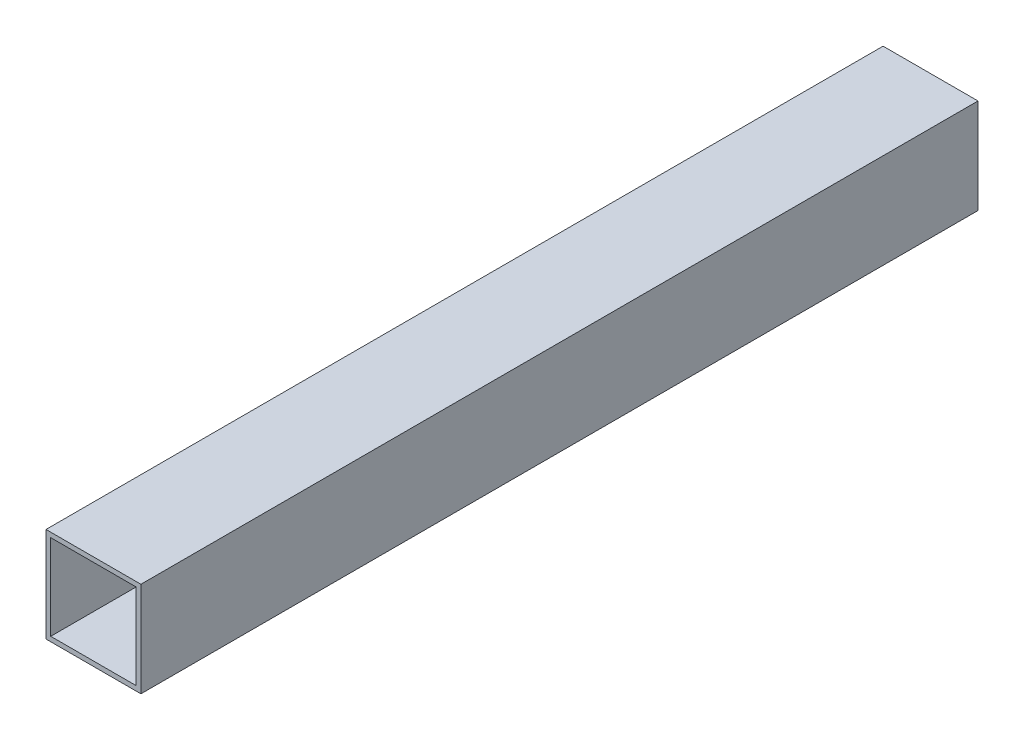
ISO-10303-21;
HEADER;
FILE_DESCRIPTION(('STEP AP214'),'2;1');
FILE_NAME('part.step','',(''),(''),'','','');
FILE_SCHEMA(('AUTOMOTIVE_DESIGN { 1 0 10303 214 1 1 1 1 }'));
ENDSEC;
DATA;
#1=APPLICATION_CONTEXT('core data for automotive mechanical design processes');
#2=APPLICATION_PROTOCOL_DEFINITION('international standard','automotive_design',2000,#1);
#3=PRODUCT_CONTEXT('',#1,'mechanical');
#4=PRODUCT('Part','Part','',(#3));
#5=PRODUCT_RELATED_PRODUCT_CATEGORY('part','',(#4));
#6=PRODUCT_DEFINITION_FORMATION('','',#4);
#7=PRODUCT_DEFINITION_CONTEXT('part definition',#1,'design');
#8=PRODUCT_DEFINITION('design','',#6,#7);
#9=PRODUCT_DEFINITION_SHAPE('','',#8);
#10=(LENGTH_UNIT() NAMED_UNIT(*) SI_UNIT(.MILLI.,.METRE.));
#11=(NAMED_UNIT(*) PLANE_ANGLE_UNIT() SI_UNIT($,.RADIAN.));
#12=(NAMED_UNIT(*) SI_UNIT($,.STERADIAN.) SOLID_ANGLE_UNIT());
#13=UNCERTAINTY_MEASURE_WITH_UNIT(LENGTH_MEASURE(1.E-05),#10,'distance_accuracy_value','');
#14=(GEOMETRIC_REPRESENTATION_CONTEXT(3) GLOBAL_UNCERTAINTY_ASSIGNED_CONTEXT((#13)) GLOBAL_UNIT_ASSIGNED_CONTEXT((#10,
#11,#12)) REPRESENTATION_CONTEXT('',''));
#15=CARTESIAN_POINT('',(0.,0.,0.));
#16=DIRECTION('',(0.,0.,1.));
#17=DIRECTION('',(1.,0.,0.));
#18=AXIS2_PLACEMENT_3D('',#15,#16,#17);
#19=CARTESIAN_POINT('',(0.,0.,280.));
#20=DIRECTION('',(0.,0.,1.));
#21=DIRECTION('',(1.,0.,0.));
#22=AXIS2_PLACEMENT_3D('',#19,#20,#21);
#23=PLANE('',#22);
#24=DIRECTION('',(0.,1.,0.));
#25=VECTOR('',#24,1.);
#26=CARTESIAN_POINT('',(15.875,15.875,280.));
#27=LINE('',#26,#25);
#28=CARTESIAN_POINT('',(15.875,-15.875,280.));
#29=VERTEX_POINT('',#28);
#30=CARTESIAN_POINT('',(15.875,15.875,280.));
#31=VERTEX_POINT('',#30);
#32=EDGE_CURVE('E134',#29,#31,#27,.T.);
#33=ORIENTED_EDGE('',*,*,#32,.T.);
#34=DIRECTION('',(-1.,0.,0.));
#35=VECTOR('',#34,1.);
#36=CARTESIAN_POINT('',(-15.875,15.875,280.));
#37=LINE('',#36,#35);
#38=CARTESIAN_POINT('',(-15.875,15.875,280.));
#39=VERTEX_POINT('',#38);
#40=EDGE_CURVE('E137',#31,#39,#37,.T.);
#41=ORIENTED_EDGE('',*,*,#40,.T.);
#42=DIRECTION('',(0.,-1.,0.));
#43=VECTOR('',#42,1.);
#44=CARTESIAN_POINT('',(-15.875,15.875,280.));
#45=LINE('',#44,#43);
#46=CARTESIAN_POINT('',(-15.875,-15.875,280.));
#47=VERTEX_POINT('',#46);
#48=EDGE_CURVE('E140',#39,#47,#45,.T.);
#49=ORIENTED_EDGE('',*,*,#48,.T.);
#50=DIRECTION('',(1.,0.,0.));
#51=VECTOR('',#50,1.);
#52=CARTESIAN_POINT('',(-15.875,-15.875,280.));
#53=LINE('',#52,#51);
#54=EDGE_CURVE('E142',#47,#29,#53,.T.);
#55=ORIENTED_EDGE('',*,*,#54,.T.);
#56=EDGE_LOOP('',(#33,#41,#49,#55));
#57=FACE_BOUND('',#56,.T.);
#58=DIRECTION('',(-1.,0.,0.));
#59=VECTOR('',#58,1.);
#60=CARTESIAN_POINT('',(-14.2875,14.2875,280.));
#61=LINE('',#60,#59);
#62=CARTESIAN_POINT('',(14.2875,14.2875,280.));
#63=VERTEX_POINT('',#62);
#64=CARTESIAN_POINT('',(-14.2875,14.2875,280.));
#65=VERTEX_POINT('',#64);
#66=EDGE_CURVE('E106',#63,#65,#61,.T.);
#67=ORIENTED_EDGE('',*,*,#66,.F.);
#68=DIRECTION('',(0.,1.,0.));
#69=VECTOR('',#68,1.);
#70=CARTESIAN_POINT('',(14.2875,14.2875,280.));
#71=LINE('',#70,#69);
#72=CARTESIAN_POINT('',(14.2875,-14.2875,280.));
#73=VERTEX_POINT('',#72);
#74=EDGE_CURVE('E98',#73,#63,#71,.T.);
#75=ORIENTED_EDGE('',*,*,#74,.F.);
#76=DIRECTION('',(1.,0.,0.));
#77=VECTOR('',#76,1.);
#78=CARTESIAN_POINT('',(-14.2875,-14.2875,280.));
#79=LINE('',#78,#77);
#80=CARTESIAN_POINT('',(-14.2875,-14.2875,280.));
#81=VERTEX_POINT('',#80);
#82=EDGE_CURVE('E120',#81,#73,#79,.T.);
#83=ORIENTED_EDGE('',*,*,#82,.F.);
#84=DIRECTION('',(0.,-1.,0.));
#85=VECTOR('',#84,1.);
#86=CARTESIAN_POINT('',(-14.2875,14.2875,280.));
#87=LINE('',#86,#85);
#88=EDGE_CURVE('E118',#65,#81,#87,.T.);
#89=ORIENTED_EDGE('',*,*,#88,.F.);
#90=EDGE_LOOP('',(#67,#75,#83,#89));
#91=FACE_BOUND('',#90,.T.);
#92=ADVANCED_FACE('F33',(#57,#91),#23,.T.);
#93=CARTESIAN_POINT('',(0.,0.,0.));
#94=DIRECTION('',(0.,0.,1.));
#95=DIRECTION('',(1.,0.,0.));
#96=AXIS2_PLACEMENT_3D('',#93,#94,#95);
#97=PLANE('',#96);
#98=DIRECTION('',(0.,1.,0.));
#99=VECTOR('',#98,1.);
#100=CARTESIAN_POINT('',(15.875,15.875,0.));
#101=LINE('',#100,#99);
#102=CARTESIAN_POINT('',(15.875,-15.875,0.));
#103=VERTEX_POINT('',#102);
#104=CARTESIAN_POINT('',(15.875,15.875,0.));
#105=VERTEX_POINT('',#104);
#106=EDGE_CURVE('E114',#103,#105,#101,.T.);
#107=ORIENTED_EDGE('',*,*,#106,.F.);
#108=DIRECTION('',(1.,0.,0.));
#109=VECTOR('',#108,1.);
#110=CARTESIAN_POINT('',(-15.875,-15.875,0.));
#111=LINE('',#110,#109);
#112=CARTESIAN_POINT('',(-15.875,-15.875,0.));
#113=VERTEX_POINT('',#112);
#114=EDGE_CURVE('E138',#113,#103,#111,.T.);
#115=ORIENTED_EDGE('',*,*,#114,.F.);
#116=DIRECTION('',(0.,-1.,0.));
#117=VECTOR('',#116,1.);
#118=CARTESIAN_POINT('',(-15.875,15.875,0.));
#119=LINE('',#118,#117);
#120=CARTESIAN_POINT('',(-15.875,15.875,0.));
#121=VERTEX_POINT('',#120);
#122=EDGE_CURVE('E149',#121,#113,#119,.T.);
#123=ORIENTED_EDGE('',*,*,#122,.F.);
#124=DIRECTION('',(-1.,0.,0.));
#125=VECTOR('',#124,1.);
#126=CARTESIAN_POINT('',(-15.875,15.875,0.));
#127=LINE('',#126,#125);
#128=EDGE_CURVE('E147',#105,#121,#127,.T.);
#129=ORIENTED_EDGE('',*,*,#128,.F.);
#130=EDGE_LOOP('',(#107,#115,#123,#129));
#131=FACE_BOUND('',#130,.T.);
#132=DIRECTION('',(0.,1.,0.));
#133=VECTOR('',#132,1.);
#134=CARTESIAN_POINT('',(14.2875,14.2875,0.));
#135=LINE('',#134,#133);
#136=CARTESIAN_POINT('',(14.2875,-14.2875,0.));
#137=VERTEX_POINT('',#136);
#138=CARTESIAN_POINT('',(14.2875,14.2875,0.));
#139=VERTEX_POINT('',#138);
#140=EDGE_CURVE('E56',#137,#139,#135,.T.);
#141=ORIENTED_EDGE('',*,*,#140,.T.);
#142=DIRECTION('',(-1.,0.,0.));
#143=VECTOR('',#142,1.);
#144=CARTESIAN_POINT('',(-14.2875,14.2875,0.));
#145=LINE('',#144,#143);
#146=CARTESIAN_POINT('',(-14.2875,14.2875,0.));
#147=VERTEX_POINT('',#146);
#148=EDGE_CURVE('E113',#139,#147,#145,.T.);
#149=ORIENTED_EDGE('',*,*,#148,.T.);
#150=DIRECTION('',(0.,-1.,0.));
#151=VECTOR('',#150,1.);
#152=CARTESIAN_POINT('',(-14.2875,14.2875,0.));
#153=LINE('',#152,#151);
#154=CARTESIAN_POINT('',(-14.2875,-14.2875,0.));
#155=VERTEX_POINT('',#154);
#156=EDGE_CURVE('E126',#147,#155,#153,.T.);
#157=ORIENTED_EDGE('',*,*,#156,.T.);
#158=DIRECTION('',(1.,0.,0.));
#159=VECTOR('',#158,1.);
#160=CARTESIAN_POINT('',(-14.2875,-14.2875,0.));
#161=LINE('',#160,#159);
#162=EDGE_CURVE('E107',#155,#137,#161,.T.);
#163=ORIENTED_EDGE('',*,*,#162,.T.);
#164=EDGE_LOOP('',(#141,#149,#157,#163));
#165=FACE_BOUND('',#164,.T.);
#166=ADVANCED_FACE('F167',(#131,#165),#97,.F.);
#167=CARTESIAN_POINT('',(15.875,15.875,280.));
#168=DIRECTION('',(-1.,0.,0.));
#169=DIRECTION('',(0.,-1.,0.));
#170=AXIS2_PLACEMENT_3D('',#167,#168,#169);
#171=PLANE('',#170);
#172=ORIENTED_EDGE('',*,*,#106,.T.);
#173=DIRECTION('',(0.,0.,-1.));
#174=VECTOR('',#173,1.);
#175=CARTESIAN_POINT('',(15.875,15.875,280.));
#176=LINE('',#175,#174);
#177=EDGE_CURVE('E11',#31,#105,#176,.T.);
#178=ORIENTED_EDGE('',*,*,#177,.F.);
#179=ORIENTED_EDGE('',*,*,#32,.F.);
#180=DIRECTION('',(0.,0.,-1.));
#181=VECTOR('',#180,1.);
#182=CARTESIAN_POINT('',(15.875,-15.875,280.));
#183=LINE('',#182,#181);
#184=EDGE_CURVE('E144',#29,#103,#183,.T.);
#185=ORIENTED_EDGE('',*,*,#184,.T.);
#186=EDGE_LOOP('',(#172,#178,#179,#185));
#187=FACE_BOUND('',#186,.T.);
#188=ADVANCED_FACE('F35',(#187),#171,.F.);
#189=CARTESIAN_POINT('',(-15.875,15.875,280.));
#190=DIRECTION('',(0.,-1.,0.));
#191=DIRECTION('',(0.,0.,-1.));
#192=AXIS2_PLACEMENT_3D('',#189,#190,#191);
#193=PLANE('',#192);
#194=ORIENTED_EDGE('',*,*,#128,.T.);
#195=DIRECTION('',(0.,0.,-1.));
#196=VECTOR('',#195,1.);
#197=CARTESIAN_POINT('',(-15.875,15.875,280.));
#198=LINE('',#197,#196);
#199=EDGE_CURVE('E41',#39,#121,#198,.T.);
#200=ORIENTED_EDGE('',*,*,#199,.F.);
#201=ORIENTED_EDGE('',*,*,#40,.F.);
#202=ORIENTED_EDGE('',*,*,#177,.T.);
#203=EDGE_LOOP('',(#194,#200,#201,#202));
#204=FACE_BOUND('',#203,.T.);
#205=ADVANCED_FACE('F177',(#204),#193,.F.);
#206=CARTESIAN_POINT('',(-15.875,15.875,280.));
#207=DIRECTION('',(1.,0.,0.));
#208=DIRECTION('',(0.,0.,-1.));
#209=AXIS2_PLACEMENT_3D('',#206,#207,#208);
#210=PLANE('',#209);
#211=ORIENTED_EDGE('',*,*,#122,.T.);
#212=DIRECTION('',(0.,0.,-1.));
#213=VECTOR('',#212,1.);
#214=CARTESIAN_POINT('',(-15.875,-15.875,280.));
#215=LINE('',#214,#213);
#216=EDGE_CURVE('E154',#47,#113,#215,.T.);
#217=ORIENTED_EDGE('',*,*,#216,.F.);
#218=ORIENTED_EDGE('',*,*,#48,.F.);
#219=ORIENTED_EDGE('',*,*,#199,.T.);
#220=EDGE_LOOP('',(#211,#217,#218,#219));
#221=FACE_BOUND('',#220,.T.);
#222=ADVANCED_FACE('F161',(#221),#210,.F.);
#223=CARTESIAN_POINT('',(-15.875,-15.875,280.));
#224=DIRECTION('',(0.,1.,0.));
#225=DIRECTION('',(0.,0.,1.));
#226=AXIS2_PLACEMENT_3D('',#223,#224,#225);
#227=PLANE('',#226);
#228=ORIENTED_EDGE('',*,*,#114,.T.);
#229=ORIENTED_EDGE('',*,*,#184,.F.);
#230=ORIENTED_EDGE('',*,*,#54,.F.);
#231=ORIENTED_EDGE('',*,*,#216,.T.);
#232=EDGE_LOOP('',(#228,#229,#230,#231));
#233=FACE_BOUND('',#232,.T.);
#234=ADVANCED_FACE('F171',(#233),#227,.F.);
#235=CARTESIAN_POINT('',(14.2875,14.2875,280.));
#236=DIRECTION('',(-1.,0.,0.));
#237=DIRECTION('',(0.,0.,1.));
#238=AXIS2_PLACEMENT_3D('',#235,#236,#237);
#239=PLANE('',#238);
#240=ORIENTED_EDGE('',*,*,#140,.F.);
#241=DIRECTION('',(0.,0.,-1.));
#242=VECTOR('',#241,1.);
#243=CARTESIAN_POINT('',(14.2875,-14.2875,280.));
#244=LINE('',#243,#242);
#245=EDGE_CURVE('E102',#73,#137,#244,.T.);
#246=ORIENTED_EDGE('',*,*,#245,.F.);
#247=ORIENTED_EDGE('',*,*,#74,.T.);
#248=DIRECTION('',(0.,0.,-1.));
#249=VECTOR('',#248,1.);
#250=CARTESIAN_POINT('',(14.2875,14.2875,280.));
#251=LINE('',#250,#249);
#252=EDGE_CURVE('E101',#63,#139,#251,.T.);
#253=ORIENTED_EDGE('',*,*,#252,.T.);
#254=EDGE_LOOP('',(#240,#246,#247,#253));
#255=FACE_BOUND('',#254,.T.);
#256=ADVANCED_FACE('F100',(#255),#239,.T.);
#257=CARTESIAN_POINT('',(-14.2875,14.2875,280.));
#258=DIRECTION('',(0.,-1.,0.));
#259=DIRECTION('',(0.,0.,-1.));
#260=AXIS2_PLACEMENT_3D('',#257,#258,#259);
#261=PLANE('',#260);
#262=ORIENTED_EDGE('',*,*,#148,.F.);
#263=ORIENTED_EDGE('',*,*,#252,.F.);
#264=ORIENTED_EDGE('',*,*,#66,.T.);
#265=DIRECTION('',(0.,0.,-1.));
#266=VECTOR('',#265,1.);
#267=CARTESIAN_POINT('',(-14.2875,14.2875,280.));
#268=LINE('',#267,#266);
#269=EDGE_CURVE('E115',#65,#147,#268,.T.);
#270=ORIENTED_EDGE('',*,*,#269,.T.);
#271=EDGE_LOOP('',(#262,#263,#264,#270));
#272=FACE_BOUND('',#271,.T.);
#273=ADVANCED_FACE('F110',(#272),#261,.T.);
#274=CARTESIAN_POINT('',(-14.2875,14.2875,280.));
#275=DIRECTION('',(1.,0.,0.));
#276=DIRECTION('',(0.,0.,-1.));
#277=AXIS2_PLACEMENT_3D('',#274,#275,#276);
#278=PLANE('',#277);
#279=ORIENTED_EDGE('',*,*,#156,.F.);
#280=ORIENTED_EDGE('',*,*,#269,.F.);
#281=ORIENTED_EDGE('',*,*,#88,.T.);
#282=DIRECTION('',(0.,0.,-1.));
#283=VECTOR('',#282,1.);
#284=CARTESIAN_POINT('',(-14.2875,-14.2875,280.));
#285=LINE('',#284,#283);
#286=EDGE_CURVE('E48',#81,#155,#285,.T.);
#287=ORIENTED_EDGE('',*,*,#286,.T.);
#288=EDGE_LOOP('',(#279,#280,#281,#287));
#289=FACE_BOUND('',#288,.T.);
#290=ADVANCED_FACE('F200',(#289),#278,.T.);
#291=CARTESIAN_POINT('',(-14.2875,-14.2875,280.));
#292=DIRECTION('',(0.,1.,0.));
#293=DIRECTION('',(0.,0.,1.));
#294=AXIS2_PLACEMENT_3D('',#291,#292,#293);
#295=PLANE('',#294);
#296=ORIENTED_EDGE('',*,*,#162,.F.);
#297=ORIENTED_EDGE('',*,*,#286,.F.);
#298=ORIENTED_EDGE('',*,*,#82,.T.);
#299=ORIENTED_EDGE('',*,*,#245,.T.);
#300=EDGE_LOOP('',(#296,#297,#298,#299));
#301=FACE_BOUND('',#300,.T.);
#302=ADVANCED_FACE('F204',(#301),#295,.T.);
#303=CLOSED_SHELL('',(#92,#166,#188,#205,#222,#234,#256,#273,#290,#302));
#304=MANIFOLD_SOLID_BREP('B2',#303);
#305=ADVANCED_BREP_SHAPE_REPRESENTATION('',(#18,#304),#14);
#306=SHAPE_DEFINITION_REPRESENTATION(#9,#305);
ENDSEC;
END-ISO-10303-21;
